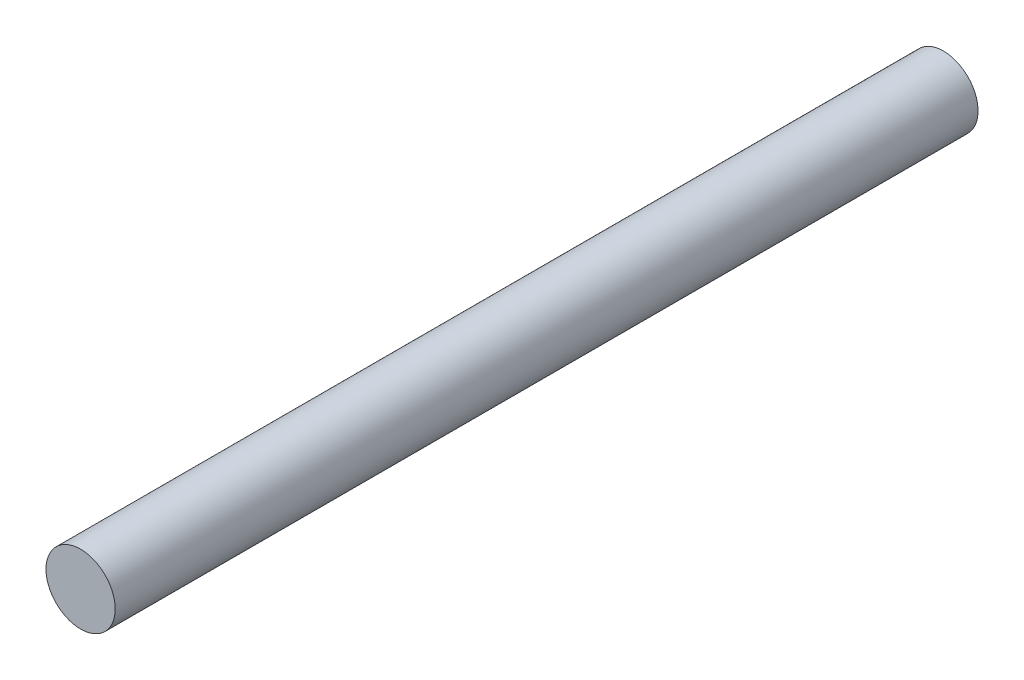
ISO-10303-21;
HEADER;
FILE_DESCRIPTION(('STEP AP214'),'2;1');
FILE_NAME('part.step','',(''),(''),'','','');
FILE_SCHEMA(('AUTOMOTIVE_DESIGN { 1 0 10303 214 1 1 1 1 }'));
ENDSEC;
DATA;
#1=APPLICATION_CONTEXT('core data for automotive mechanical design processes');
#2=APPLICATION_PROTOCOL_DEFINITION('international standard','automotive_design',2000,#1);
#3=PRODUCT_CONTEXT('',#1,'mechanical');
#4=PRODUCT('Part','Part','',(#3));
#5=PRODUCT_RELATED_PRODUCT_CATEGORY('part','',(#4));
#6=PRODUCT_DEFINITION_FORMATION('','',#4);
#7=PRODUCT_DEFINITION_CONTEXT('part definition',#1,'design');
#8=PRODUCT_DEFINITION('design','',#6,#7);
#9=PRODUCT_DEFINITION_SHAPE('','',#8);
#10=(LENGTH_UNIT() NAMED_UNIT(*) SI_UNIT(.MILLI.,.METRE.));
#11=(NAMED_UNIT(*) PLANE_ANGLE_UNIT() SI_UNIT($,.RADIAN.));
#12=(NAMED_UNIT(*) SI_UNIT($,.STERADIAN.) SOLID_ANGLE_UNIT());
#13=UNCERTAINTY_MEASURE_WITH_UNIT(LENGTH_MEASURE(1.E-05),#10,'distance_accuracy_value','');
#14=(GEOMETRIC_REPRESENTATION_CONTEXT(3) GLOBAL_UNCERTAINTY_ASSIGNED_CONTEXT((#13)) GLOBAL_UNIT_ASSIGNED_CONTEXT((#10,
#11,#12)) REPRESENTATION_CONTEXT('',''));
#15=CARTESIAN_POINT('',(0.,0.,0.));
#16=DIRECTION('',(0.,0.,1.));
#17=DIRECTION('',(1.,0.,0.));
#18=AXIS2_PLACEMENT_3D('',#15,#16,#17);
#19=CARTESIAN_POINT('',(0.,0.,360.));
#20=DIRECTION('',(0.,0.,-1.));
#21=DIRECTION('',(-1.,0.,0.));
#22=AXIS2_PLACEMENT_3D('',#19,#20,#21);
#23=CYLINDRICAL_SURFACE('',#22,14.44);
#24=CARTESIAN_POINT('',(0.,0.,360.));
#25=DIRECTION('',(0.,0.,1.));
#26=DIRECTION('',(1.,0.,0.));
#27=AXIS2_PLACEMENT_3D('',#24,#25,#26);
#28=CIRCLE('',#27,14.44);
#29=CARTESIAN_POINT('',(-14.44,0.,360.));
#30=VERTEX_POINT('',#29);
#31=EDGE_CURVE('E10',#30,#30,#28,.T.);
#32=CARTESIAN_POINT('',(0.,0.,0.));
#33=DIRECTION('',(0.,0.,1.));
#34=DIRECTION('',(1.,0.,0.));
#35=AXIS2_PLACEMENT_3D('',#32,#33,#34);
#36=CIRCLE('',#35,14.44);
#37=CARTESIAN_POINT('',(-14.44,0.,0.));
#38=VERTEX_POINT('',#37);
#39=EDGE_CURVE('E40',#38,#38,#36,.T.);
#40=CARTESIAN_POINT('',(-14.44,0.,360.));
#41=CARTESIAN_POINT('',(-14.44,0.,356.25));
#42=CARTESIAN_POINT('',(-14.44,0.,352.5));
#43=CARTESIAN_POINT('',(-14.44,0.,345.));
#44=CARTESIAN_POINT('',(-14.44,0.,341.25));
#45=CARTESIAN_POINT('',(-14.44,0.,333.75));
#46=CARTESIAN_POINT('',(-14.44,0.,330.));
#47=CARTESIAN_POINT('',(-14.44,0.,322.5));
#48=CARTESIAN_POINT('',(-14.44,0.,318.75));
#49=CARTESIAN_POINT('',(-14.44,0.,311.25));
#50=CARTESIAN_POINT('',(-14.44,0.,307.5));
#51=CARTESIAN_POINT('',(-14.44,0.,300.));
#52=CARTESIAN_POINT('',(-14.44,0.,296.25));
#53=CARTESIAN_POINT('',(-14.44,0.,288.75));
#54=CARTESIAN_POINT('',(-14.44,0.,285.));
#55=CARTESIAN_POINT('',(-14.44,0.,277.5));
#56=CARTESIAN_POINT('',(-14.44,0.,273.75));
#57=CARTESIAN_POINT('',(-14.44,0.,266.25));
#58=CARTESIAN_POINT('',(-14.44,0.,262.5));
#59=CARTESIAN_POINT('',(-14.44,0.,255.));
#60=CARTESIAN_POINT('',(-14.44,0.,251.25));
#61=CARTESIAN_POINT('',(-14.44,0.,243.75));
#62=CARTESIAN_POINT('',(-14.44,0.,240.));
#63=CARTESIAN_POINT('',(-14.44,0.,232.5));
#64=CARTESIAN_POINT('',(-14.44,0.,228.75));
#65=CARTESIAN_POINT('',(-14.44,0.,221.25));
#66=CARTESIAN_POINT('',(-14.44,0.,217.5));
#67=CARTESIAN_POINT('',(-14.44,0.,210.));
#68=CARTESIAN_POINT('',(-14.44,0.,206.25));
#69=CARTESIAN_POINT('',(-14.44,0.,198.75));
#70=CARTESIAN_POINT('',(-14.44,0.,195.));
#71=CARTESIAN_POINT('',(-14.44,0.,187.5));
#72=CARTESIAN_POINT('',(-14.44,0.,183.75));
#73=CARTESIAN_POINT('',(-14.44,0.,176.25));
#74=CARTESIAN_POINT('',(-14.44,0.,172.5));
#75=CARTESIAN_POINT('',(-14.44,0.,165.));
#76=CARTESIAN_POINT('',(-14.44,0.,161.25));
#77=CARTESIAN_POINT('',(-14.44,0.,153.75));
#78=CARTESIAN_POINT('',(-14.44,0.,150.));
#79=CARTESIAN_POINT('',(-14.44,0.,142.5));
#80=CARTESIAN_POINT('',(-14.44,0.,138.75));
#81=CARTESIAN_POINT('',(-14.44,0.,131.25));
#82=CARTESIAN_POINT('',(-14.44,0.,127.5));
#83=CARTESIAN_POINT('',(-14.44,0.,120.));
#84=CARTESIAN_POINT('',(-14.44,0.,116.25));
#85=CARTESIAN_POINT('',(-14.44,0.,108.75));
#86=CARTESIAN_POINT('',(-14.44,0.,105.));
#87=CARTESIAN_POINT('',(-14.44,0.,97.5));
#88=CARTESIAN_POINT('',(-14.44,0.,93.75));
#89=CARTESIAN_POINT('',(-14.44,0.,86.25));
#90=CARTESIAN_POINT('',(-14.44,0.,82.5));
#91=CARTESIAN_POINT('',(-14.44,0.,75.));
#92=CARTESIAN_POINT('',(-14.44,0.,71.25));
#93=CARTESIAN_POINT('',(-14.44,0.,63.75));
#94=CARTESIAN_POINT('',(-14.44,0.,60.));
#95=CARTESIAN_POINT('',(-14.44,0.,52.5));
#96=CARTESIAN_POINT('',(-14.44,0.,48.75));
#97=CARTESIAN_POINT('',(-14.44,0.,41.25));
#98=CARTESIAN_POINT('',(-14.44,0.,37.5));
#99=CARTESIAN_POINT('',(-14.44,0.,30.));
#100=CARTESIAN_POINT('',(-14.44,0.,26.25));
#101=CARTESIAN_POINT('',(-14.44,0.,18.75));
#102=CARTESIAN_POINT('',(-14.44,0.,15.));
#103=CARTESIAN_POINT('',(-14.44,0.,7.49999999999999));
#104=CARTESIAN_POINT('',(-14.44,0.,3.75));
#105=CARTESIAN_POINT('',(-14.44,0.,0.));
#106=B_SPLINE_CURVE_WITH_KNOTS('',3,(#40,#41,#42,#43,#44,#45,#46,#47,#48,#49,#50,#51,#52,#53,
#54,#55,#56,#57,#58,#59,#60,#61,#62,#63,#64,#65,#66,#67,#68,#69,#70,#71,#72,#73,#74,#75,#76,#77,
#78,#79,#80,#81,#82,#83,#84,#85,#86,#87,#88,#89,#90,#91,#92,#93,#94,#95,#96,#97,#98,#99,#100,
#101,#102,#103,#104,#105),.UNSPECIFIED.,.F.,.F.,(4,2,2,2,2,2,2,2,2,2,2,2,2,2,2,2,2,2,2,2,2,2,2,
2,2,2,2,2,2,2,2,2,4),(0.,11.25,22.5,33.75,45.,56.25,67.5000000000001,78.75,90.,101.25,112.5,
123.75,135.,146.25,157.5,168.75,180.,191.25,202.5,213.75,225.,236.25,247.5,258.75,270.,281.25,
292.5,303.75,315.,326.25,337.5,348.75,360.),.UNSPECIFIED.);
#107=EDGE_CURVE('BSEAM37',#30,#38,#106,.T.);
#108=ORIENTED_EDGE('',*,*,#31,.F.);
#109=ORIENTED_EDGE('',*,*,#39,.T.);
#110=ORIENTED_EDGE('',*,*,#107,.T.);
#111=ORIENTED_EDGE('',*,*,#107,.F.);
#112=EDGE_LOOP('',(#108,#110,#109,#111));
#113=FACE_BOUND('',#112,.T.);
#114=ADVANCED_FACE('F37',(#113),#23,.T.);
#115=CARTESIAN_POINT('',(0.,0.,360.));
#116=DIRECTION('',(0.,0.,1.));
#117=DIRECTION('',(1.,0.,0.));
#118=AXIS2_PLACEMENT_3D('',#115,#116,#117);
#119=PLANE('',#118);
#120=ORIENTED_EDGE('',*,*,#31,.T.);
#121=EDGE_LOOP('',(#120));
#122=FACE_BOUND('',#121,.T.);
#123=ADVANCED_FACE('F52',(#122),#119,.T.);
#124=CARTESIAN_POINT('',(0.,0.,0.));
#125=DIRECTION('',(0.,0.,1.));
#126=DIRECTION('',(1.,0.,0.));
#127=AXIS2_PLACEMENT_3D('',#124,#125,#126);
#128=PLANE('',#127);
#129=ORIENTED_EDGE('',*,*,#39,.F.);
#130=EDGE_LOOP('',(#129));
#131=FACE_BOUND('',#130,.T.);
#132=ADVANCED_FACE('F50',(#131),#128,.F.);
#133=CLOSED_SHELL('',(#114,#123,#132));
#134=MANIFOLD_SOLID_BREP('B2',#133);
#135=ADVANCED_BREP_SHAPE_REPRESENTATION('',(#18,#134),#14);
#136=SHAPE_DEFINITION_REPRESENTATION(#9,#135);
ENDSEC;
END-ISO-10303-21;
